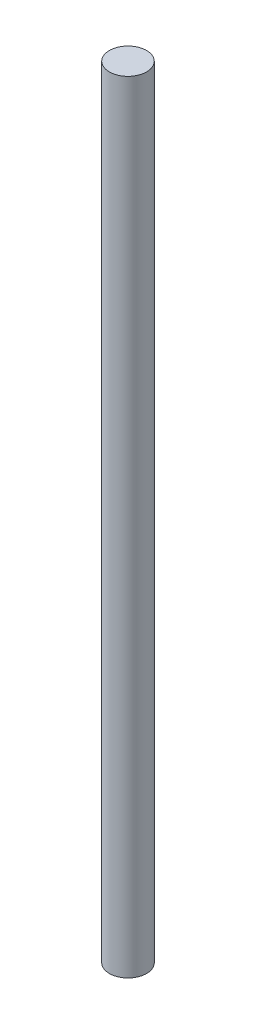
ISO-10303-21;
HEADER;
FILE_DESCRIPTION(('STEP AP214'),'2;1');
FILE_NAME('part.step','',(''),(''),'','','');
FILE_SCHEMA(('AUTOMOTIVE_DESIGN { 1 0 10303 214 1 1 1 1 }'));
ENDSEC;
DATA;
#1=APPLICATION_CONTEXT('core data for automotive mechanical design processes');
#2=APPLICATION_PROTOCOL_DEFINITION('international standard','automotive_design',2000,#1);
#3=PRODUCT_CONTEXT('',#1,'mechanical');
#4=PRODUCT('Part','Part','',(#3));
#5=PRODUCT_RELATED_PRODUCT_CATEGORY('part','',(#4));
#6=PRODUCT_DEFINITION_FORMATION('','',#4);
#7=PRODUCT_DEFINITION_CONTEXT('part definition',#1,'design');
#8=PRODUCT_DEFINITION('design','',#6,#7);
#9=PRODUCT_DEFINITION_SHAPE('','',#8);
#10=(LENGTH_UNIT() NAMED_UNIT(*) SI_UNIT(.MILLI.,.METRE.));
#11=(NAMED_UNIT(*) PLANE_ANGLE_UNIT() SI_UNIT($,.RADIAN.));
#12=(NAMED_UNIT(*) SI_UNIT($,.STERADIAN.) SOLID_ANGLE_UNIT());
#13=UNCERTAINTY_MEASURE_WITH_UNIT(LENGTH_MEASURE(1.E-05),#10,'distance_accuracy_value','');
#14=(GEOMETRIC_REPRESENTATION_CONTEXT(3) GLOBAL_UNCERTAINTY_ASSIGNED_CONTEXT((#13)) GLOBAL_UNIT_ASSIGNED_CONTEXT((#10,
#11,#12)) REPRESENTATION_CONTEXT('',''));
#15=CARTESIAN_POINT('',(0.,0.,0.));
#16=DIRECTION('',(0.,0.,1.));
#17=DIRECTION('',(1.,0.,0.));
#18=AXIS2_PLACEMENT_3D('',#15,#16,#17);
#19=CARTESIAN_POINT('',(0.,200.,0.));
#20=DIRECTION('',(0.,-1.,0.));
#21=DIRECTION('',(0.,0.,-1.));
#22=AXIS2_PLACEMENT_3D('',#19,#20,#21);
#23=CYLINDRICAL_SURFACE('',#22,4.7625);
#24=CARTESIAN_POINT('',(0.,200.,0.));
#25=DIRECTION('',(0.,1.,0.));
#26=DIRECTION('',(0.,0.,1.));
#27=AXIS2_PLACEMENT_3D('',#24,#25,#26);
#28=CIRCLE('',#27,4.7625);
#29=CARTESIAN_POINT('',(0.,200.,4.7625));
#30=VERTEX_POINT('',#29);
#31=EDGE_CURVE('E10',#30,#30,#28,.T.);
#32=ORIENTED_EDGE('',*,*,#31,.F.);
#33=EDGE_LOOP('',(#32));
#34=FACE_BOUND('',#33,.T.);
#35=CARTESIAN_POINT('',(0.,0.,0.));
#36=DIRECTION('',(0.,1.,0.));
#37=DIRECTION('',(0.,0.,1.));
#38=AXIS2_PLACEMENT_3D('',#35,#36,#37);
#39=CIRCLE('',#38,4.7625);
#40=CARTESIAN_POINT('',(0.,0.,4.7625));
#41=VERTEX_POINT('',#40);
#42=EDGE_CURVE('E45',#41,#41,#39,.T.);
#43=ORIENTED_EDGE('',*,*,#42,.T.);
#44=EDGE_LOOP('',(#43));
#45=FACE_BOUND('',#44,.T.);
#46=ADVANCED_FACE('F39',(#34,#45),#23,.T.);
#47=CARTESIAN_POINT('',(0.,200.,0.));
#48=DIRECTION('',(0.,1.,0.));
#49=DIRECTION('',(0.,0.,1.));
#50=AXIS2_PLACEMENT_3D('',#47,#48,#49);
#51=PLANE('',#50);
#52=ORIENTED_EDGE('',*,*,#31,.T.);
#53=EDGE_LOOP('',(#52));
#54=FACE_BOUND('',#53,.T.);
#55=ADVANCED_FACE('F53',(#54),#51,.T.);
#56=CARTESIAN_POINT('',(0.,0.,0.));
#57=DIRECTION('',(0.,1.,0.));
#58=DIRECTION('',(0.,0.,1.));
#59=AXIS2_PLACEMENT_3D('',#56,#57,#58);
#60=PLANE('',#59);
#61=ORIENTED_EDGE('',*,*,#42,.F.);
#62=EDGE_LOOP('',(#61));
#63=FACE_BOUND('',#62,.T.);
#64=ADVANCED_FACE('F55',(#63),#60,.F.);
#65=CLOSED_SHELL('',(#46,#55,#64));
#66=MANIFOLD_SOLID_BREP('B2',#65);
#67=ADVANCED_BREP_SHAPE_REPRESENTATION('',(#18,#66),#14);
#68=SHAPE_DEFINITION_REPRESENTATION(#9,#67);
ENDSEC;
END-ISO-10303-21;
